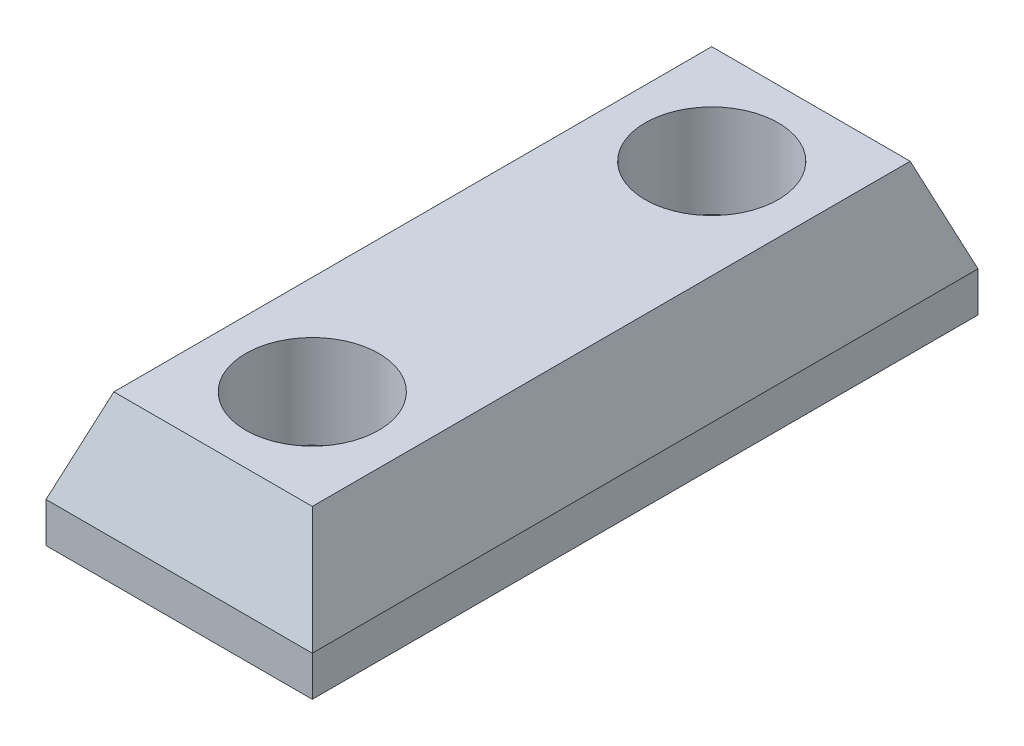
ISO-10303-21;
HEADER;
FILE_DESCRIPTION(('STEP AP214'),'2;1');
FILE_NAME('part.step','',(''),(''),'','','');
FILE_SCHEMA(('AUTOMOTIVE_DESIGN { 1 0 10303 214 1 1 1 1 }'));
ENDSEC;
DATA;
#1=APPLICATION_CONTEXT('core data for automotive mechanical design processes');
#2=APPLICATION_PROTOCOL_DEFINITION('international standard','automotive_design',2000,#1);
#3=PRODUCT_CONTEXT('',#1,'mechanical');
#4=PRODUCT('Part','Part','',(#3));
#5=PRODUCT_RELATED_PRODUCT_CATEGORY('part','',(#4));
#6=PRODUCT_DEFINITION_FORMATION('','',#4);
#7=PRODUCT_DEFINITION_CONTEXT('part definition',#1,'design');
#8=PRODUCT_DEFINITION('design','',#6,#7);
#9=PRODUCT_DEFINITION_SHAPE('','',#8);
#10=(LENGTH_UNIT() NAMED_UNIT(*) SI_UNIT(.MILLI.,.METRE.));
#11=(NAMED_UNIT(*) PLANE_ANGLE_UNIT() SI_UNIT($,.RADIAN.));
#12=(NAMED_UNIT(*) SI_UNIT($,.STERADIAN.) SOLID_ANGLE_UNIT());
#13=UNCERTAINTY_MEASURE_WITH_UNIT(LENGTH_MEASURE(1.E-05),#10,'distance_accuracy_value','');
#14=(GEOMETRIC_REPRESENTATION_CONTEXT(3) GLOBAL_UNCERTAINTY_ASSIGNED_CONTEXT((#13)) GLOBAL_UNIT_ASSIGNED_CONTEXT((#10,
#11,#12)) REPRESENTATION_CONTEXT('',''));
#15=CARTESIAN_POINT('',(0.,0.,0.));
#16=DIRECTION('',(0.,0.,1.));
#17=DIRECTION('',(1.,0.,0.));
#18=AXIS2_PLACEMENT_3D('',#15,#16,#17);
#19=CARTESIAN_POINT('',(-10.,3.,-40.));
#20=DIRECTION('',(0.,-1.,0.));
#21=DIRECTION('',(0.,0.,-1.));
#22=AXIS2_PLACEMENT_3D('',#19,#20,#21);
#23=CYLINDRICAL_SURFACE('',#22,2.5);
#24=CARTESIAN_POINT('',(-10.,3.,-40.));
#25=DIRECTION('',(0.,1.,0.));
#26=DIRECTION('',(0.,0.,1.));
#27=AXIS2_PLACEMENT_3D('',#24,#25,#26);
#28=CIRCLE('',#27,2.5);
#29=CARTESIAN_POINT('',(-10.,3.,-37.5));
#30=VERTEX_POINT('',#29);
#31=EDGE_CURVE('E145',#30,#30,#28,.T.);
#32=ORIENTED_EDGE('',*,*,#31,.T.);
#33=EDGE_LOOP('',(#32));
#34=FACE_BOUND('',#33,.T.);
#35=CARTESIAN_POINT('',(-10.,0.,-40.));
#36=DIRECTION('',(0.,1.,0.));
#37=DIRECTION('',(0.,0.,1.));
#38=AXIS2_PLACEMENT_3D('',#35,#36,#37);
#39=CIRCLE('',#38,2.5);
#40=CARTESIAN_POINT('',(-10.,0.,-37.5));
#41=VERTEX_POINT('',#40);
#42=EDGE_CURVE('E144',#41,#41,#39,.T.);
#43=ORIENTED_EDGE('',*,*,#42,.F.);
#44=EDGE_LOOP('',(#43));
#45=FACE_BOUND('',#44,.T.);
#46=ADVANCED_FACE('F43',(#34,#45),#23,.F.);
#47=CARTESIAN_POINT('',(0.,3.,0.));
#48=DIRECTION('',(0.,1.,0.));
#49=DIRECTION('',(0.,0.,1.));
#50=AXIS2_PLACEMENT_3D('',#47,#48,#49);
#51=PLANE('',#50);
#52=ORIENTED_EDGE('',*,*,#31,.F.);
#53=EDGE_LOOP('',(#52));
#54=FACE_BOUND('',#53,.T.);
#55=CARTESIAN_POINT('',(-10.,3.,-40.));
#56=DIRECTION('',(0.,1.,0.));
#57=DIRECTION('',(0.,0.,1.));
#58=AXIS2_PLACEMENT_3D('',#55,#56,#57);
#59=CIRCLE('',#58,5.);
#60=CARTESIAN_POINT('',(-10.,3.,-35.));
#61=VERTEX_POINT('',#60);
#62=EDGE_CURVE('E104',#61,#61,#59,.F.);
#63=ORIENTED_EDGE('',*,*,#62,.F.);
#64=EDGE_LOOP('',(#63));
#65=FACE_BOUND('',#64,.T.);
#66=ADVANCED_FACE('F229',(#54,#65),#51,.T.);
#67=CARTESIAN_POINT('',(0.,0.,0.));
#68=DIRECTION('',(0.,1.,0.));
#69=DIRECTION('',(0.,0.,1.));
#70=AXIS2_PLACEMENT_3D('',#67,#68,#69);
#71=PLANE('',#70);
#72=ORIENTED_EDGE('',*,*,#42,.T.);
#73=EDGE_LOOP('',(#72));
#74=FACE_BOUND('',#73,.T.);
#75=DIRECTION('',(0.,0.,-1.));
#76=VECTOR('',#75,1.);
#77=CARTESIAN_POINT('',(-20.,0.,0.));
#78=LINE('',#77,#76);
#79=CARTESIAN_POINT('',(-20.,0.,0.));
#80=VERTEX_POINT('',#79);
#81=CARTESIAN_POINT('',(-20.,0.,-50.));
#82=VERTEX_POINT('',#81);
#83=EDGE_CURVE('E108',#80,#82,#78,.T.);
#84=ORIENTED_EDGE('',*,*,#83,.T.);
#85=DIRECTION('',(-1.,0.,0.));
#86=VECTOR('',#85,1.);
#87=CARTESIAN_POINT('',(0.,0.,-50.));
#88=LINE('',#87,#86);
#89=CARTESIAN_POINT('',(0.,0.,-50.));
#90=VERTEX_POINT('',#89);
#91=EDGE_CURVE('E126',#90,#82,#88,.T.);
#92=ORIENTED_EDGE('',*,*,#91,.F.);
#93=DIRECTION('',(0.,0.,-1.));
#94=VECTOR('',#93,1.);
#95=CARTESIAN_POINT('',(0.,0.,0.));
#96=LINE('',#95,#94);
#97=CARTESIAN_POINT('',(0.,0.,0.));
#98=VERTEX_POINT('',#97);
#99=EDGE_CURVE('E122',#98,#90,#96,.T.);
#100=ORIENTED_EDGE('',*,*,#99,.F.);
#101=DIRECTION('',(-1.,0.,0.));
#102=VECTOR('',#101,1.);
#103=CARTESIAN_POINT('',(0.,0.,0.));
#104=LINE('',#103,#102);
#105=EDGE_CURVE('E100',#98,#80,#104,.T.);
#106=ORIENTED_EDGE('',*,*,#105,.T.);
#107=EDGE_LOOP('',(#84,#92,#100,#106));
#108=FACE_BOUND('',#107,.T.);
#109=CARTESIAN_POINT('',(-10.,0.,-10.));
#110=DIRECTION('',(0.,1.,0.));
#111=DIRECTION('',(0.,0.,1.));
#112=AXIS2_PLACEMENT_3D('',#109,#110,#111);
#113=CIRCLE('',#112,2.5);
#114=CARTESIAN_POINT('',(-10.,0.,-7.5));
#115=VERTEX_POINT('',#114);
#116=EDGE_CURVE('E191',#115,#115,#113,.T.);
#117=ORIENTED_EDGE('',*,*,#116,.T.);
#118=EDGE_LOOP('',(#117));
#119=FACE_BOUND('',#118,.T.);
#120=ADVANCED_FACE('F119',(#74,#108,#119),#71,.F.);
#121=CARTESIAN_POINT('',(-20.,10.,0.));
#122=DIRECTION('',(-1.,0.,0.));
#123=DIRECTION('',(0.,0.,1.));
#124=AXIS2_PLACEMENT_3D('',#121,#122,#123);
#125=PLANE('',#124);
#126=DIRECTION('',(0.,-1.,0.));
#127=VECTOR('',#126,1.);
#128=CARTESIAN_POINT('',(-20.,10.,0.));
#129=LINE('',#128,#127);
#130=CARTESIAN_POINT('',(-20.,2.99999999999992,0.));
#131=VERTEX_POINT('',#130);
#132=EDGE_CURVE('E96',#131,#80,#129,.T.);
#133=ORIENTED_EDGE('',*,*,#132,.F.);
#134=DIRECTION('',(0.,0.,-1.));
#135=VECTOR('',#134,1.);
#136=CARTESIAN_POINT('',(-20.,2.99999999999992,0.));
#137=LINE('',#136,#135);
#138=CARTESIAN_POINT('',(-20.,2.99999999999992,-50.));
#139=VERTEX_POINT('',#138);
#140=EDGE_CURVE('E173',#131,#139,#137,.T.);
#141=ORIENTED_EDGE('',*,*,#140,.T.);
#142=DIRECTION('',(0.,-1.,0.));
#143=VECTOR('',#142,1.);
#144=CARTESIAN_POINT('',(-20.,10.,-50.));
#145=LINE('',#144,#143);
#146=EDGE_CURVE('E111',#139,#82,#145,.T.);
#147=ORIENTED_EDGE('',*,*,#146,.T.);
#148=ORIENTED_EDGE('',*,*,#83,.F.);
#149=EDGE_LOOP('',(#133,#141,#147,#148));
#150=FACE_BOUND('',#149,.T.);
#151=ADVANCED_FACE('F109',(#150),#125,.T.);
#152=CARTESIAN_POINT('',(0.,10.,0.));
#153=DIRECTION('',(0.,0.,1.));
#154=DIRECTION('',(1.,0.,0.));
#155=AXIS2_PLACEMENT_3D('',#152,#153,#154);
#156=PLANE('',#155);
#157=DIRECTION('',(0.,-1.,0.));
#158=VECTOR('',#157,1.);
#159=CARTESIAN_POINT('',(0.,10.,0.));
#160=LINE('',#159,#158);
#161=CARTESIAN_POINT('',(0.,2.99999999999992,0.));
#162=VERTEX_POINT('',#161);
#163=EDGE_CURVE('E105',#162,#98,#160,.T.);
#164=ORIENTED_EDGE('',*,*,#163,.F.);
#165=DIRECTION('',(-1.,0.,0.));
#166=VECTOR('',#165,1.);
#167=CARTESIAN_POINT('',(0.,2.99999999999992,0.));
#168=LINE('',#167,#166);
#169=EDGE_CURVE('E54',#162,#131,#168,.T.);
#170=ORIENTED_EDGE('',*,*,#169,.T.);
#171=ORIENTED_EDGE('',*,*,#132,.T.);
#172=ORIENTED_EDGE('',*,*,#105,.F.);
#173=EDGE_LOOP('',(#164,#170,#171,#172));
#174=FACE_BOUND('',#173,.T.);
#175=ADVANCED_FACE('F98',(#174),#156,.T.);
#176=CARTESIAN_POINT('',(0.,10.,0.));
#177=DIRECTION('',(-1.,0.,0.));
#178=DIRECTION('',(0.,0.,1.));
#179=AXIS2_PLACEMENT_3D('',#176,#177,#178);
#180=PLANE('',#179);
#181=DIRECTION('',(0.,-1.,0.));
#182=VECTOR('',#181,1.);
#183=CARTESIAN_POINT('',(0.,10.,-50.));
#184=LINE('',#183,#182);
#185=CARTESIAN_POINT('',(0.,2.99999999999992,-50.));
#186=VERTEX_POINT('',#185);
#187=EDGE_CURVE('E135',#186,#90,#184,.T.);
#188=ORIENTED_EDGE('',*,*,#187,.F.);
#189=DIRECTION('',(0.,0.,1.));
#190=VECTOR('',#189,1.);
#191=CARTESIAN_POINT('',(0.,2.99999999999992,0.));
#192=LINE('',#191,#190);
#193=EDGE_CURVE('E11',#186,#162,#192,.T.);
#194=ORIENTED_EDGE('',*,*,#193,.T.);
#195=ORIENTED_EDGE('',*,*,#163,.T.);
#196=ORIENTED_EDGE('',*,*,#99,.T.);
#197=EDGE_LOOP('',(#188,#194,#195,#196));
#198=FACE_BOUND('',#197,.T.);
#199=ADVANCED_FACE('F271',(#198),#180,.F.);
#200=CARTESIAN_POINT('',(-10.,10.,-10.));
#201=DIRECTION('',(0.,-1.,0.));
#202=DIRECTION('',(0.,0.,-1.));
#203=AXIS2_PLACEMENT_3D('',#200,#201,#202);
#204=CYLINDRICAL_SURFACE('',#203,5.);
#205=CARTESIAN_POINT('',(-10.,3.,-10.));
#206=DIRECTION('',(0.,1.,0.));
#207=DIRECTION('',(0.,0.,1.));
#208=AXIS2_PLACEMENT_3D('',#205,#206,#207);
#209=CIRCLE('',#208,5.);
#210=CARTESIAN_POINT('',(-10.,3.,-5.));
#211=VERTEX_POINT('',#210);
#212=EDGE_CURVE('E149',#211,#211,#209,.T.);
#213=ORIENTED_EDGE('',*,*,#212,.F.);
#214=EDGE_LOOP('',(#213));
#215=FACE_BOUND('',#214,.T.);
#216=CARTESIAN_POINT('',(-10.,10.,-10.));
#217=DIRECTION('',(0.,1.,0.));
#218=DIRECTION('',(0.,0.,1.));
#219=AXIS2_PLACEMENT_3D('',#216,#217,#218);
#220=CIRCLE('',#219,5.);
#221=CARTESIAN_POINT('',(-10.,10.,-5.));
#222=VERTEX_POINT('',#221);
#223=EDGE_CURVE('E136',#222,#222,#220,.T.);
#224=ORIENTED_EDGE('',*,*,#223,.T.);
#225=EDGE_LOOP('',(#224));
#226=FACE_BOUND('',#225,.T.);
#227=ADVANCED_FACE('F209',(#215,#226),#204,.F.);
#228=CARTESIAN_POINT('',(-10.,10.,-40.));
#229=DIRECTION('',(0.,-1.,0.));
#230=DIRECTION('',(0.,0.,-1.));
#231=AXIS2_PLACEMENT_3D('',#228,#229,#230);
#232=CYLINDRICAL_SURFACE('',#231,5.);
#233=ORIENTED_EDGE('',*,*,#62,.T.);
#234=EDGE_LOOP('',(#233));
#235=FACE_BOUND('',#234,.T.);
#236=CARTESIAN_POINT('',(-10.,10.,-40.));
#237=DIRECTION('',(0.,1.,0.));
#238=DIRECTION('',(0.,0.,1.));
#239=AXIS2_PLACEMENT_3D('',#236,#237,#238);
#240=CIRCLE('',#239,5.);
#241=CARTESIAN_POINT('',(-10.,10.,-35.));
#242=VERTEX_POINT('',#241);
#243=EDGE_CURVE('E132',#242,#242,#240,.T.);
#244=ORIENTED_EDGE('',*,*,#243,.T.);
#245=EDGE_LOOP('',(#244));
#246=FACE_BOUND('',#245,.T.);
#247=ADVANCED_FACE('F224',(#235,#246),#232,.F.);
#248=CARTESIAN_POINT('',(0.,10.,-50.));
#249=DIRECTION('',(0.,0.,1.));
#250=DIRECTION('',(1.,0.,0.));
#251=AXIS2_PLACEMENT_3D('',#248,#249,#250);
#252=PLANE('',#251);
#253=ORIENTED_EDGE('',*,*,#146,.F.);
#254=DIRECTION('',(1.,0.,0.));
#255=VECTOR('',#254,1.);
#256=CARTESIAN_POINT('',(0.,2.99999999999992,-50.));
#257=LINE('',#256,#255);
#258=EDGE_CURVE('E169',#139,#186,#257,.T.);
#259=ORIENTED_EDGE('',*,*,#258,.T.);
#260=ORIENTED_EDGE('',*,*,#187,.T.);
#261=ORIENTED_EDGE('',*,*,#91,.T.);
#262=EDGE_LOOP('',(#253,#259,#260,#261));
#263=FACE_BOUND('',#262,.T.);
#264=ADVANCED_FACE('F214',(#263),#252,.F.);
#265=CARTESIAN_POINT('',(0.,10.,0.));
#266=DIRECTION('',(0.,1.,0.));
#267=DIRECTION('',(0.,0.,1.));
#268=AXIS2_PLACEMENT_3D('',#265,#266,#267);
#269=PLANE('',#268);
#270=DIRECTION('',(0.,0.,-1.));
#271=VECTOR('',#270,1.);
#272=CARTESIAN_POINT('',(-2.54779163986342,10.,-50.));
#273=LINE('',#272,#271);
#274=CARTESIAN_POINT('',(-2.54779163986342,10.,-2.54779163986342));
#275=VERTEX_POINT('',#274);
#276=CARTESIAN_POINT('',(-2.54779163986342,10.,-47.4522083601366));
#277=VERTEX_POINT('',#276);
#278=EDGE_CURVE('E156',#275,#277,#273,.T.);
#279=ORIENTED_EDGE('',*,*,#278,.T.);
#280=DIRECTION('',(-1.,0.,0.));
#281=VECTOR('',#280,1.);
#282=CARTESIAN_POINT('',(-20.,10.,-47.4522083601366));
#283=LINE('',#282,#281);
#284=CARTESIAN_POINT('',(-17.4522083601366,10.,-47.4522083601366));
#285=VERTEX_POINT('',#284);
#286=EDGE_CURVE('E165',#277,#285,#283,.T.);
#287=ORIENTED_EDGE('',*,*,#286,.T.);
#288=DIRECTION('',(0.,0.,1.));
#289=VECTOR('',#288,1.);
#290=CARTESIAN_POINT('',(-17.4522083601366,10.,0.));
#291=LINE('',#290,#289);
#292=CARTESIAN_POINT('',(-17.4522083601366,10.,-2.54779163986342));
#293=VERTEX_POINT('',#292);
#294=EDGE_CURVE('E162',#285,#293,#291,.T.);
#295=ORIENTED_EDGE('',*,*,#294,.T.);
#296=DIRECTION('',(1.,0.,0.));
#297=VECTOR('',#296,1.);
#298=CARTESIAN_POINT('',(0.,10.,-2.54779163986342));
#299=LINE('',#298,#297);
#300=EDGE_CURVE('E159',#293,#275,#299,.T.);
#301=ORIENTED_EDGE('',*,*,#300,.T.);
#302=EDGE_LOOP('',(#279,#287,#295,#301));
#303=FACE_BOUND('',#302,.T.);
#304=ORIENTED_EDGE('',*,*,#243,.F.);
#305=EDGE_LOOP('',(#304));
#306=FACE_BOUND('',#305,.T.);
#307=ORIENTED_EDGE('',*,*,#223,.F.);
#308=EDGE_LOOP('',(#307));
#309=FACE_BOUND('',#308,.T.);
#310=ADVANCED_FACE('F211',(#303,#306,#309),#269,.T.);
#311=CARTESIAN_POINT('',(-10.,3.,-10.));
#312=DIRECTION('',(0.,-1.,0.));
#313=DIRECTION('',(0.,0.,-1.));
#314=AXIS2_PLACEMENT_3D('',#311,#312,#313);
#315=CYLINDRICAL_SURFACE('',#314,2.5);
#316=CARTESIAN_POINT('',(-10.,3.,-10.));
#317=DIRECTION('',(0.,1.,0.));
#318=DIRECTION('',(0.,0.,1.));
#319=AXIS2_PLACEMENT_3D('',#316,#317,#318);
#320=CIRCLE('',#319,2.5);
#321=CARTESIAN_POINT('',(-10.,3.,-7.5));
#322=VERTEX_POINT('',#321);
#323=EDGE_CURVE('E116',#322,#322,#320,.T.);
#324=ORIENTED_EDGE('',*,*,#323,.T.);
#325=EDGE_LOOP('',(#324));
#326=FACE_BOUND('',#325,.T.);
#327=ORIENTED_EDGE('',*,*,#116,.F.);
#328=EDGE_LOOP('',(#327));
#329=FACE_BOUND('',#328,.T.);
#330=ADVANCED_FACE('F213',(#326,#329),#315,.F.);
#331=CARTESIAN_POINT('',(0.,3.,0.));
#332=DIRECTION('',(0.,1.,0.));
#333=DIRECTION('',(0.,0.,1.));
#334=AXIS2_PLACEMENT_3D('',#331,#332,#333);
#335=PLANE('',#334);
#336=ORIENTED_EDGE('',*,*,#212,.T.);
#337=EDGE_LOOP('',(#336));
#338=FACE_BOUND('',#337,.T.);
#339=ORIENTED_EDGE('',*,*,#323,.F.);
#340=EDGE_LOOP('',(#339));
#341=FACE_BOUND('',#340,.T.);
#342=ADVANCED_FACE('F221',(#338,#341),#335,.T.);
#343=CARTESIAN_POINT('',(0.,2.99999999999992,0.));
#344=DIRECTION('',(0.,-0.342020143325666,-0.939692620785909));
#345=DIRECTION('',(-1.,0.,0.));
#346=AXIS2_PLACEMENT_3D('',#343,#344,#345);
#347=PLANE('',#346);
#348=DIRECTION('',(-0.323615577118183,-0.88912649071599,0.323615577118183));
#349=VECTOR('',#348,1.);
#350=CARTESIAN_POINT('',(-17.9054591649293,8.75470364848232,-2.09454083507069));
#351=LINE('',#350,#349);
#352=EDGE_CURVE('E183',#131,#293,#351,.F.);
#353=ORIENTED_EDGE('',*,*,#352,.F.);
#354=ORIENTED_EDGE('',*,*,#169,.F.);
#355=DIRECTION('',(-0.323615577118183,0.88912649071599,-0.323615577118183));
#356=VECTOR('',#355,1.);
#357=CARTESIAN_POINT('',(-2.28096895841614,9.26691070772525,-2.28096895841614));
#358=LINE('',#357,#356);
#359=EDGE_CURVE('E48',#275,#162,#358,.F.);
#360=ORIENTED_EDGE('',*,*,#359,.F.);
#361=ORIENTED_EDGE('',*,*,#300,.F.);
#362=EDGE_LOOP('',(#353,#354,#360,#361));
#363=FACE_BOUND('',#362,.T.);
#364=ADVANCED_FACE('F46',(#363),#347,.F.);
#365=CARTESIAN_POINT('',(-2.54779163986342,10.,0.));
#366=DIRECTION('',(0.939692620785909,0.342020143325666,0.));
#367=DIRECTION('',(0.,0.,1.));
#368=AXIS2_PLACEMENT_3D('',#365,#366,#367);
#369=PLANE('',#368);
#370=ORIENTED_EDGE('',*,*,#359,.T.);
#371=ORIENTED_EDGE('',*,*,#193,.F.);
#372=DIRECTION('',(-0.323615577118183,0.88912649071599,0.323615577118182));
#373=VECTOR('',#372,1.);
#374=CARTESIAN_POINT('',(-7.51732104609285,23.6536698289312,-42.4826789539071));
#375=LINE('',#374,#373);
#376=EDGE_CURVE('E181',#277,#186,#375,.F.);
#377=ORIENTED_EDGE('',*,*,#376,.F.);
#378=ORIENTED_EDGE('',*,*,#278,.F.);
#379=EDGE_LOOP('',(#370,#371,#377,#378));
#380=FACE_BOUND('',#379,.T.);
#381=ADVANCED_FACE('F253',(#380),#369,.T.);
#382=CARTESIAN_POINT('',(-20.,2.99999999999992,0.));
#383=DIRECTION('',(0.939692620785909,-0.342020143325666,0.));
#384=DIRECTION('',(0.,0.,-1.));
#385=AXIS2_PLACEMENT_3D('',#382,#383,#384);
#386=PLANE('',#385);
#387=ORIENTED_EDGE('',*,*,#352,.T.);
#388=ORIENTED_EDGE('',*,*,#294,.F.);
#389=DIRECTION('',(0.323615577118183,0.88912649071599,0.323615577118182));
#390=VECTOR('',#389,1.);
#391=CARTESIAN_POINT('',(-14.7636479123233,17.3867591212059,-44.7636479123233));
#392=LINE('',#391,#390);
#393=EDGE_CURVE('E178',#139,#285,#392,.T.);
#394=ORIENTED_EDGE('',*,*,#393,.F.);
#395=ORIENTED_EDGE('',*,*,#140,.F.);
#396=EDGE_LOOP('',(#387,#388,#394,#395));
#397=FACE_BOUND('',#396,.T.);
#398=ADVANCED_FACE('F247',(#397),#386,.F.);
#399=CARTESIAN_POINT('',(0.,10.,-47.4522083601366));
#400=DIRECTION('',(0.,0.342020143325666,-0.939692620785909));
#401=DIRECTION('',(1.,0.,0.));
#402=AXIS2_PLACEMENT_3D('',#399,#400,#401);
#403=PLANE('',#402);
#404=ORIENTED_EDGE('',*,*,#376,.T.);
#405=ORIENTED_EDGE('',*,*,#258,.F.);
#406=ORIENTED_EDGE('',*,*,#393,.T.);
#407=ORIENTED_EDGE('',*,*,#286,.F.);
#408=EDGE_LOOP('',(#404,#405,#406,#407));
#409=FACE_BOUND('',#408,.T.);
#410=ADVANCED_FACE('F241',(#409),#403,.T.);
#411=CLOSED_SHELL('',(#46,#66,#120,#151,#175,#199,#227,#247,#264,#310,#330,#342,#364,#381,#398,#410));
#412=MANIFOLD_SOLID_BREP('B2',#411);
#413=ADVANCED_BREP_SHAPE_REPRESENTATION('',(#18,#412),#14);
#414=SHAPE_DEFINITION_REPRESENTATION(#9,#413);
ENDSEC;
END-ISO-10303-21;
